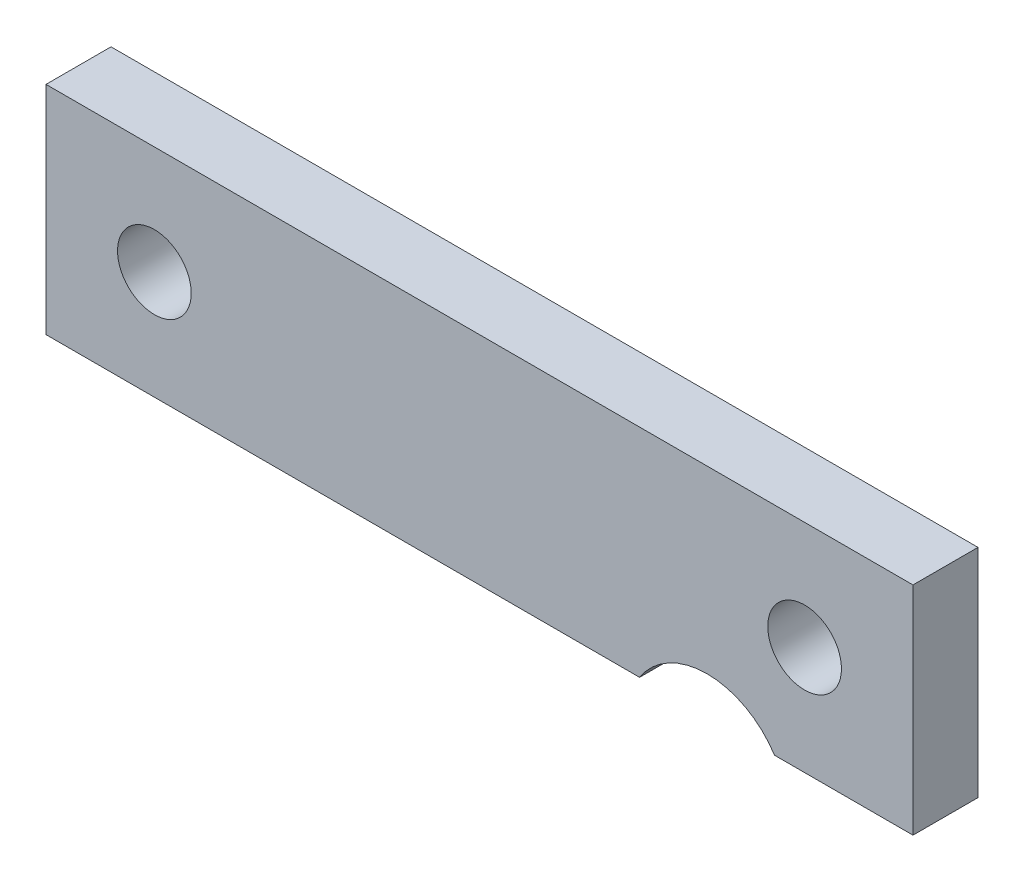
ISO-10303-21;
HEADER;
FILE_DESCRIPTION(('STEP AP214'),'2;1');
FILE_NAME('part.step','',(''),(''),'','','');
FILE_SCHEMA(('AUTOMOTIVE_DESIGN { 1 0 10303 214 1 1 1 1 }'));
ENDSEC;
DATA;
#1=APPLICATION_CONTEXT('core data for automotive mechanical design processes');
#2=APPLICATION_PROTOCOL_DEFINITION('international standard','automotive_design',2000,#1);
#3=PRODUCT_CONTEXT('',#1,'mechanical');
#4=PRODUCT('Part','Part','',(#3));
#5=PRODUCT_RELATED_PRODUCT_CATEGORY('part','',(#4));
#6=PRODUCT_DEFINITION_FORMATION('','',#4);
#7=PRODUCT_DEFINITION_CONTEXT('part definition',#1,'design');
#8=PRODUCT_DEFINITION('design','',#6,#7);
#9=PRODUCT_DEFINITION_SHAPE('','',#8);
#10=(LENGTH_UNIT() NAMED_UNIT(*) SI_UNIT(.MILLI.,.METRE.));
#11=(NAMED_UNIT(*) PLANE_ANGLE_UNIT() SI_UNIT($,.RADIAN.));
#12=(NAMED_UNIT(*) SI_UNIT($,.STERADIAN.) SOLID_ANGLE_UNIT());
#13=UNCERTAINTY_MEASURE_WITH_UNIT(LENGTH_MEASURE(1.E-05),#10,'distance_accuracy_value','');
#14=(GEOMETRIC_REPRESENTATION_CONTEXT(3) GLOBAL_UNCERTAINTY_ASSIGNED_CONTEXT((#13)) GLOBAL_UNIT_ASSIGNED_CONTEXT((#10,
#11,#12)) REPRESENTATION_CONTEXT('',''));
#15=CARTESIAN_POINT('',(0.,0.,0.));
#16=DIRECTION('',(0.,0.,1.));
#17=DIRECTION('',(1.,0.,0.));
#18=AXIS2_PLACEMENT_3D('',#15,#16,#17);
#19=CARTESIAN_POINT('',(35.,-31.5,41.5));
#20=DIRECTION('',(-1.,0.,0.));
#21=DIRECTION('',(0.,0.,1.));
#22=AXIS2_PLACEMENT_3D('',#19,#20,#21);
#23=PLANE('',#22);
#24=DIRECTION('',(0.,-1.,0.));
#25=VECTOR('',#24,1.);
#26=CARTESIAN_POINT('',(35.,-31.5,44.5));
#27=LINE('',#26,#25);
#28=CARTESIAN_POINT('',(35.,-31.5,44.5));
#29=VERTEX_POINT('',#28);
#30=CARTESIAN_POINT('',(35.,-41.5,44.5));
#31=VERTEX_POINT('',#30);
#32=EDGE_CURVE('E127',#29,#31,#27,.T.);
#33=ORIENTED_EDGE('',*,*,#32,.F.);
#34=DIRECTION('',(0.,0.,1.));
#35=VECTOR('',#34,1.);
#36=CARTESIAN_POINT('',(35.,-31.5,41.5));
#37=LINE('',#36,#35);
#38=CARTESIAN_POINT('',(35.,-31.5,41.5));
#39=VERTEX_POINT('',#38);
#40=EDGE_CURVE('E11',#39,#29,#37,.T.);
#41=ORIENTED_EDGE('',*,*,#40,.F.);
#42=DIRECTION('',(0.,-1.,0.));
#43=VECTOR('',#42,1.);
#44=CARTESIAN_POINT('',(35.,-31.5,41.5));
#45=LINE('',#44,#43);
#46=CARTESIAN_POINT('',(35.,-41.5,41.5));
#47=VERTEX_POINT('',#46);
#48=EDGE_CURVE('E143',#39,#47,#45,.T.);
#49=ORIENTED_EDGE('',*,*,#48,.T.);
#50=DIRECTION('',(0.,0.,1.));
#51=VECTOR('',#50,1.);
#52=CARTESIAN_POINT('',(35.,-41.5,41.5));
#53=LINE('',#52,#51);
#54=EDGE_CURVE('E42',#47,#31,#53,.T.);
#55=ORIENTED_EDGE('',*,*,#54,.T.);
#56=EDGE_LOOP('',(#33,#41,#49,#55));
#57=FACE_BOUND('',#56,.T.);
#58=ADVANCED_FACE('F41',(#57),#23,.T.);
#59=CARTESIAN_POINT('',(35.,-31.5,41.5));
#60=DIRECTION('',(0.,1.,0.));
#61=DIRECTION('',(0.,0.,1.));
#62=AXIS2_PLACEMENT_3D('',#59,#60,#61);
#63=PLANE('',#62);
#64=DIRECTION('',(-1.,0.,0.));
#65=VECTOR('',#64,1.);
#66=CARTESIAN_POINT('',(35.,-31.5,44.5));
#67=LINE('',#66,#65);
#68=CARTESIAN_POINT('',(75.,-31.5,44.5));
#69=VERTEX_POINT('',#68);
#70=EDGE_CURVE('E136',#69,#29,#67,.T.);
#71=ORIENTED_EDGE('',*,*,#70,.F.);
#72=DIRECTION('',(0.,0.,1.));
#73=VECTOR('',#72,1.);
#74=CARTESIAN_POINT('',(75.,-31.5,41.5));
#75=LINE('',#74,#73);
#76=CARTESIAN_POINT('',(75.,-31.5,41.5));
#77=VERTEX_POINT('',#76);
#78=EDGE_CURVE('E49',#77,#69,#75,.T.);
#79=ORIENTED_EDGE('',*,*,#78,.F.);
#80=DIRECTION('',(-1.,0.,0.));
#81=VECTOR('',#80,1.);
#82=CARTESIAN_POINT('',(35.,-31.5,41.5));
#83=LINE('',#82,#81);
#84=EDGE_CURVE('E117',#77,#39,#83,.T.);
#85=ORIENTED_EDGE('',*,*,#84,.T.);
#86=ORIENTED_EDGE('',*,*,#40,.T.);
#87=EDGE_LOOP('',(#71,#79,#85,#86));
#88=FACE_BOUND('',#87,.T.);
#89=ADVANCED_FACE('F149',(#88),#63,.T.);
#90=CARTESIAN_POINT('',(75.,-31.5,41.5));
#91=DIRECTION('',(1.,0.,0.));
#92=DIRECTION('',(0.,0.,-1.));
#93=AXIS2_PLACEMENT_3D('',#90,#91,#92);
#94=PLANE('',#93);
#95=DIRECTION('',(0.,1.,0.));
#96=VECTOR('',#95,1.);
#97=CARTESIAN_POINT('',(75.,-31.5,44.5));
#98=LINE('',#97,#96);
#99=CARTESIAN_POINT('',(75.,-41.5,44.5));
#100=VERTEX_POINT('',#99);
#101=EDGE_CURVE('E103',#100,#69,#98,.T.);
#102=ORIENTED_EDGE('',*,*,#101,.F.);
#103=DIRECTION('',(0.,0.,1.));
#104=VECTOR('',#103,1.);
#105=CARTESIAN_POINT('',(75.,-41.5,41.5));
#106=LINE('',#105,#104);
#107=CARTESIAN_POINT('',(75.,-41.5,41.5));
#108=VERTEX_POINT('',#107);
#109=EDGE_CURVE('E98',#108,#100,#106,.T.);
#110=ORIENTED_EDGE('',*,*,#109,.F.);
#111=DIRECTION('',(0.,1.,0.));
#112=VECTOR('',#111,1.);
#113=CARTESIAN_POINT('',(75.,-31.5,41.5));
#114=LINE('',#113,#112);
#115=EDGE_CURVE('E101',#108,#77,#114,.T.);
#116=ORIENTED_EDGE('',*,*,#115,.T.);
#117=ORIENTED_EDGE('',*,*,#78,.T.);
#118=EDGE_LOOP('',(#102,#110,#116,#117));
#119=FACE_BOUND('',#118,.T.);
#120=ADVANCED_FACE('F99',(#119),#94,.T.);
#121=CARTESIAN_POINT('',(68.6128764832545,-41.5,41.5));
#122=DIRECTION('',(0.,-1.,0.));
#123=DIRECTION('',(0.,0.,-1.));
#124=AXIS2_PLACEMENT_3D('',#121,#122,#123);
#125=PLANE('',#124);
#126=DIRECTION('',(1.,0.,0.));
#127=VECTOR('',#126,1.);
#128=CARTESIAN_POINT('',(68.6128764832545,-41.5,44.5));
#129=LINE('',#128,#127);
#130=CARTESIAN_POINT('',(68.6128764832545,-41.5,44.5));
#131=VERTEX_POINT('',#130);
#132=EDGE_CURVE('E137',#131,#100,#129,.T.);
#133=ORIENTED_EDGE('',*,*,#132,.F.);
#134=DIRECTION('',(0.,0.,1.));
#135=VECTOR('',#134,1.);
#136=CARTESIAN_POINT('',(68.6128764832545,-41.5,41.5));
#137=LINE('',#136,#135);
#138=CARTESIAN_POINT('',(68.6128764832545,-41.5,41.5));
#139=VERTEX_POINT('',#138);
#140=EDGE_CURVE('E107',#139,#131,#137,.T.);
#141=ORIENTED_EDGE('',*,*,#140,.F.);
#142=DIRECTION('',(1.,0.,0.));
#143=VECTOR('',#142,1.);
#144=CARTESIAN_POINT('',(68.6128764832545,-41.5,41.5));
#145=LINE('',#144,#143);
#146=EDGE_CURVE('E111',#139,#108,#145,.T.);
#147=ORIENTED_EDGE('',*,*,#146,.T.);
#148=ORIENTED_EDGE('',*,*,#109,.T.);
#149=EDGE_LOOP('',(#133,#141,#147,#148));
#150=FACE_BOUND('',#149,.T.);
#151=ADVANCED_FACE('F119',(#150),#125,.T.);
#152=CARTESIAN_POINT('',(65.5000000000001,-43.5,41.5));
#153=DIRECTION('',(0.,0.,1.));
#154=DIRECTION('',(1.,0.,0.));
#155=AXIS2_PLACEMENT_3D('',#152,#153,#154);
#156=CYLINDRICAL_SURFACE('',#155,3.6999999999998);
#157=CARTESIAN_POINT('',(65.5000000000001,-43.5,44.5));
#158=DIRECTION('',(0.,0.,-1.));
#159=DIRECTION('',(1.,0.,0.));
#160=AXIS2_PLACEMENT_3D('',#157,#158,#159);
#161=CIRCLE('',#160,3.6999999999998);
#162=CARTESIAN_POINT('',(62.3871235167455,-41.5000000000002,44.5));
#163=VERTEX_POINT('',#162);
#164=EDGE_CURVE('E134',#163,#131,#161,.T.);
#165=ORIENTED_EDGE('',*,*,#164,.F.);
#166=DIRECTION('',(0.,0.,1.));
#167=VECTOR('',#166,1.);
#168=CARTESIAN_POINT('',(62.3871235167455,-41.5000000000002,41.5));
#169=LINE('',#168,#167);
#170=CARTESIAN_POINT('',(62.3871235167455,-41.5000000000002,41.5));
#171=VERTEX_POINT('',#170);
#172=EDGE_CURVE('E145',#171,#163,#169,.T.);
#173=ORIENTED_EDGE('',*,*,#172,.F.);
#174=CARTESIAN_POINT('',(65.5000000000001,-43.5,41.5));
#175=DIRECTION('',(0.,0.,-1.));
#176=DIRECTION('',(1.,0.,0.));
#177=AXIS2_PLACEMENT_3D('',#174,#175,#176);
#178=CIRCLE('',#177,3.6999999999998);
#179=EDGE_CURVE('E116',#171,#139,#178,.T.);
#180=ORIENTED_EDGE('',*,*,#179,.T.);
#181=ORIENTED_EDGE('',*,*,#140,.T.);
#182=EDGE_LOOP('',(#165,#173,#180,#181));
#183=FACE_BOUND('',#182,.T.);
#184=ADVANCED_FACE('F165',(#183),#156,.F.);
#185=CARTESIAN_POINT('',(35.,-41.5,41.5));
#186=DIRECTION('',(0.,-1.,0.));
#187=DIRECTION('',(1.,0.,0.));
#188=AXIS2_PLACEMENT_3D('',#185,#186,#187);
#189=PLANE('',#188);
#190=DIRECTION('',(1.,0.,0.));
#191=VECTOR('',#190,1.);
#192=CARTESIAN_POINT('',(35.,-41.5,44.5));
#193=LINE('',#192,#191);
#194=EDGE_CURVE('E129',#31,#163,#193,.T.);
#195=ORIENTED_EDGE('',*,*,#194,.F.);
#196=ORIENTED_EDGE('',*,*,#54,.F.);
#197=DIRECTION('',(1.,0.,0.));
#198=VECTOR('',#197,1.);
#199=CARTESIAN_POINT('',(35.,-41.5,41.5));
#200=LINE('',#199,#198);
#201=EDGE_CURVE('E122',#47,#171,#200,.T.);
#202=ORIENTED_EDGE('',*,*,#201,.T.);
#203=ORIENTED_EDGE('',*,*,#172,.T.);
#204=EDGE_LOOP('',(#195,#196,#202,#203));
#205=FACE_BOUND('',#204,.T.);
#206=ADVANCED_FACE('F148',(#205),#189,.T.);
#207=CARTESIAN_POINT('',(65.5000000000001,-43.5,41.5));
#208=DIRECTION('',(0.,0.,1.));
#209=DIRECTION('',(1.,0.,0.));
#210=AXIS2_PLACEMENT_3D('',#207,#208,#209);
#211=PLANE('',#210);
#212=CARTESIAN_POINT('',(70.,-36.5,41.5));
#213=DIRECTION('',(0.,0.,1.));
#214=DIRECTION('',(1.,0.,0.));
#215=AXIS2_PLACEMENT_3D('',#212,#213,#214);
#216=CIRCLE('',#215,1.69999999999999);
#217=CARTESIAN_POINT('',(71.7,-36.5,41.5));
#218=VERTEX_POINT('',#217);
#219=EDGE_CURVE('E189',#218,#218,#216,.T.);
#220=ORIENTED_EDGE('',*,*,#219,.T.);
#221=EDGE_LOOP('',(#220));
#222=FACE_BOUND('',#221,.T.);
#223=CARTESIAN_POINT('',(40.,-36.5,41.5));
#224=DIRECTION('',(0.,0.,1.));
#225=DIRECTION('',(1.,0.,0.));
#226=AXIS2_PLACEMENT_3D('',#223,#224,#225);
#227=CIRCLE('',#226,1.7);
#228=CARTESIAN_POINT('',(41.7,-36.5,41.5));
#229=VERTEX_POINT('',#228);
#230=EDGE_CURVE('E128',#229,#229,#227,.T.);
#231=ORIENTED_EDGE('',*,*,#230,.T.);
#232=EDGE_LOOP('',(#231));
#233=FACE_BOUND('',#232,.T.);
#234=ORIENTED_EDGE('',*,*,#48,.F.);
#235=ORIENTED_EDGE('',*,*,#84,.F.);
#236=ORIENTED_EDGE('',*,*,#115,.F.);
#237=ORIENTED_EDGE('',*,*,#146,.F.);
#238=ORIENTED_EDGE('',*,*,#179,.F.);
#239=ORIENTED_EDGE('',*,*,#201,.F.);
#240=EDGE_LOOP('',(#234,#235,#236,#237,#238,#239));
#241=FACE_BOUND('',#240,.T.);
#242=ADVANCED_FACE('F115',(#222,#233,#241),#211,.F.);
#243=CARTESIAN_POINT('',(65.5000000000001,-43.5,44.5));
#244=DIRECTION('',(0.,0.,1.));
#245=DIRECTION('',(1.,0.,0.));
#246=AXIS2_PLACEMENT_3D('',#243,#244,#245);
#247=PLANE('',#246);
#248=CARTESIAN_POINT('',(70.,-36.5,44.5));
#249=DIRECTION('',(0.,0.,1.));
#250=DIRECTION('',(1.,0.,0.));
#251=AXIS2_PLACEMENT_3D('',#248,#249,#250);
#252=CIRCLE('',#251,1.69999999999999);
#253=CARTESIAN_POINT('',(71.7,-36.5,44.5));
#254=VERTEX_POINT('',#253);
#255=EDGE_CURVE('E192',#254,#254,#252,.T.);
#256=ORIENTED_EDGE('',*,*,#255,.F.);
#257=EDGE_LOOP('',(#256));
#258=FACE_BOUND('',#257,.T.);
#259=CARTESIAN_POINT('',(40.,-36.5,44.5));
#260=DIRECTION('',(0.,0.,1.));
#261=DIRECTION('',(1.,0.,0.));
#262=AXIS2_PLACEMENT_3D('',#259,#260,#261);
#263=CIRCLE('',#262,1.7);
#264=CARTESIAN_POINT('',(41.7,-36.5,44.5));
#265=VERTEX_POINT('',#264);
#266=EDGE_CURVE('E194',#265,#265,#263,.T.);
#267=ORIENTED_EDGE('',*,*,#266,.F.);
#268=EDGE_LOOP('',(#267));
#269=FACE_BOUND('',#268,.T.);
#270=ORIENTED_EDGE('',*,*,#32,.T.);
#271=ORIENTED_EDGE('',*,*,#194,.T.);
#272=ORIENTED_EDGE('',*,*,#164,.T.);
#273=ORIENTED_EDGE('',*,*,#132,.T.);
#274=ORIENTED_EDGE('',*,*,#101,.T.);
#275=ORIENTED_EDGE('',*,*,#70,.T.);
#276=EDGE_LOOP('',(#270,#271,#272,#273,#274,#275));
#277=FACE_BOUND('',#276,.T.);
#278=ADVANCED_FACE('F146',(#258,#269,#277),#247,.T.);
#279=CARTESIAN_POINT('',(40.,-36.5,41.5));
#280=DIRECTION('',(0.,0.,1.));
#281=DIRECTION('',(1.,0.,0.));
#282=AXIS2_PLACEMENT_3D('',#279,#280,#281);
#283=CYLINDRICAL_SURFACE('',#282,1.7);
#284=ORIENTED_EDGE('',*,*,#230,.F.);
#285=EDGE_LOOP('',(#284));
#286=FACE_BOUND('',#285,.T.);
#287=ORIENTED_EDGE('',*,*,#266,.T.);
#288=EDGE_LOOP('',(#287));
#289=FACE_BOUND('',#288,.T.);
#290=ADVANCED_FACE('F174',(#286,#289),#283,.F.);
#291=CARTESIAN_POINT('',(70.,-36.5,41.5));
#292=DIRECTION('',(0.,0.,1.));
#293=DIRECTION('',(1.,0.,0.));
#294=AXIS2_PLACEMENT_3D('',#291,#292,#293);
#295=CYLINDRICAL_SURFACE('',#294,1.69999999999999);
#296=ORIENTED_EDGE('',*,*,#219,.F.);
#297=EDGE_LOOP('',(#296));
#298=FACE_BOUND('',#297,.T.);
#299=ORIENTED_EDGE('',*,*,#255,.T.);
#300=EDGE_LOOP('',(#299));
#301=FACE_BOUND('',#300,.T.);
#302=ADVANCED_FACE('F178',(#298,#301),#295,.F.);
#303=CLOSED_SHELL('',(#58,#89,#120,#151,#184,#206,#242,#278,#290,#302));
#304=MANIFOLD_SOLID_BREP('B2',#303);
#305=ADVANCED_BREP_SHAPE_REPRESENTATION('',(#18,#304),#14);
#306=SHAPE_DEFINITION_REPRESENTATION(#9,#305);
ENDSEC;
END-ISO-10303-21;
